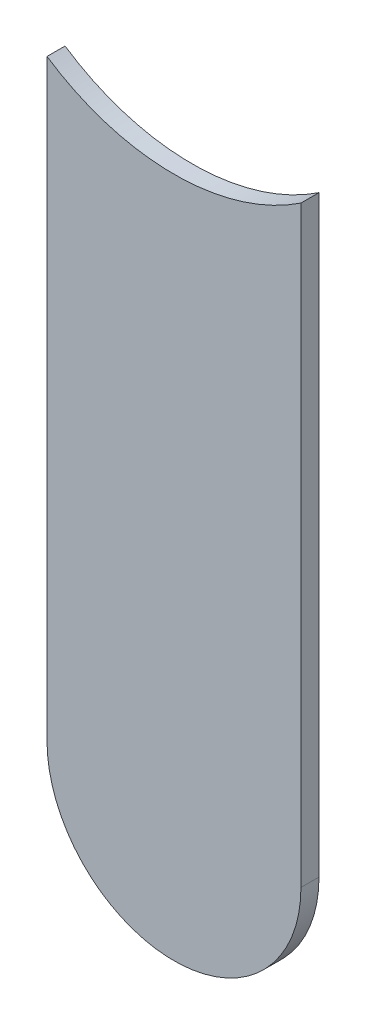
ISO-10303-21;
HEADER;
FILE_DESCRIPTION(('STEP AP214'),'2;1');
FILE_NAME('part.step','',(''),(''),'','','');
FILE_SCHEMA(('AUTOMOTIVE_DESIGN { 1 0 10303 214 1 1 1 1 }'));
ENDSEC;
DATA;
#1=APPLICATION_CONTEXT('core data for automotive mechanical design processes');
#2=APPLICATION_PROTOCOL_DEFINITION('international standard','automotive_design',2000,#1);
#3=PRODUCT_CONTEXT('',#1,'mechanical');
#4=PRODUCT('Part','Part','',(#3));
#5=PRODUCT_RELATED_PRODUCT_CATEGORY('part','',(#4));
#6=PRODUCT_DEFINITION_FORMATION('','',#4);
#7=PRODUCT_DEFINITION_CONTEXT('part definition',#1,'design');
#8=PRODUCT_DEFINITION('design','',#6,#7);
#9=PRODUCT_DEFINITION_SHAPE('','',#8);
#10=(LENGTH_UNIT() NAMED_UNIT(*) SI_UNIT(.MILLI.,.METRE.));
#11=(NAMED_UNIT(*) PLANE_ANGLE_UNIT() SI_UNIT($,.RADIAN.));
#12=(NAMED_UNIT(*) SI_UNIT($,.STERADIAN.) SOLID_ANGLE_UNIT());
#13=UNCERTAINTY_MEASURE_WITH_UNIT(LENGTH_MEASURE(1.E-05),#10,'distance_accuracy_value','');
#14=(GEOMETRIC_REPRESENTATION_CONTEXT(3) GLOBAL_UNCERTAINTY_ASSIGNED_CONTEXT((#13)) GLOBAL_UNIT_ASSIGNED_CONTEXT((#10,
#11,#12)) REPRESENTATION_CONTEXT('',''));
#15=CARTESIAN_POINT('',(0.,0.,0.));
#16=DIRECTION('',(0.,0.,1.));
#17=DIRECTION('',(1.,0.,0.));
#18=AXIS2_PLACEMENT_3D('',#15,#16,#17);
#19=CARTESIAN_POINT('',(94.0810031,92.6267896,0.));
#20=DIRECTION('',(-1.,0.,0.));
#21=DIRECTION('',(0.,1.,0.));
#22=AXIS2_PLACEMENT_3D('',#19,#20,#21);
#23=PLANE('',#22);
#24=DIRECTION('',(0.,1.,0.));
#25=VECTOR('',#24,1.);
#26=CARTESIAN_POINT('',(94.0810031,92.6267896,0.03556));
#27=LINE('',#26,#25);
#28=CARTESIAN_POINT('',(94.0810031,92.6267896,0.03556));
#29=VERTEX_POINT('',#28);
#30=CARTESIAN_POINT('',(94.0810031,93.7938458096541,0.03556));
#31=VERTEX_POINT('',#30);
#32=EDGE_CURVE('E11',#29,#31,#27,.T.);
#33=ORIENTED_EDGE('',*,*,#32,.F.);
#34=DIRECTION('',(0.,0.,1.));
#35=VECTOR('',#34,1.);
#36=CARTESIAN_POINT('',(94.0810031,92.6267896,0.));
#37=LINE('',#36,#35);
#38=CARTESIAN_POINT('',(94.0810031,92.6267896,0.));
#39=VERTEX_POINT('',#38);
#40=EDGE_CURVE('E24',#39,#29,#37,.T.);
#41=ORIENTED_EDGE('',*,*,#40,.F.);
#42=DIRECTION('',(0.,1.,0.));
#43=VECTOR('',#42,1.);
#44=CARTESIAN_POINT('',(94.0810031,92.6267896,0.));
#45=LINE('',#44,#43);
#46=CARTESIAN_POINT('',(94.0810031,93.7938458096541,0.));
#47=VERTEX_POINT('',#46);
#48=EDGE_CURVE('E75',#39,#47,#45,.T.);
#49=ORIENTED_EDGE('',*,*,#48,.T.);
#50=DIRECTION('',(0.,0.,1.));
#51=VECTOR('',#50,1.);
#52=CARTESIAN_POINT('',(94.0810031,93.7938458096541,0.));
#53=LINE('',#52,#51);
#54=EDGE_CURVE('E37',#47,#31,#53,.T.);
#55=ORIENTED_EDGE('',*,*,#54,.T.);
#56=EDGE_LOOP('',(#33,#41,#49,#55));
#57=FACE_BOUND('',#56,.T.);
#58=ADVANCED_FACE('F17',(#57),#23,.F.);
#59=CARTESIAN_POINT('',(93.8310036,94.1680108,0.));
#60=DIRECTION('',(0.,0.,-1.));
#61=DIRECTION('',(1.,0.,0.));
#62=AXIS2_PLACEMENT_3D('',#59,#60,#61);
#63=CYLINDRICAL_SURFACE('',#62,0.4499991);
#64=DIRECTION('',(0.,0.,1.));
#65=VECTOR('',#64,1.);
#66=CARTESIAN_POINT('',(93.5810041,93.7938458096541,0.));
#67=LINE('',#66,#65);
#68=CARTESIAN_POINT('',(93.5810041,93.7938458096541,0.));
#69=VERTEX_POINT('',#68);
#70=CARTESIAN_POINT('',(93.5810041,93.7938458096541,0.03556));
#71=VERTEX_POINT('',#70);
#72=EDGE_CURVE('E67',#69,#71,#67,.T.);
#73=ORIENTED_EDGE('',*,*,#72,.T.);
#74=CARTESIAN_POINT('',(93.8310036,94.1680108,0.03556));
#75=DIRECTION('',(0.,0.,1.));
#76=DIRECTION('',(1.,0.,0.));
#77=AXIS2_PLACEMENT_3D('',#74,#75,#76);
#78=CIRCLE('',#77,0.4499991);
#79=EDGE_CURVE('E82',#71,#31,#78,.T.);
#80=ORIENTED_EDGE('',*,*,#79,.T.);
#81=ORIENTED_EDGE('',*,*,#54,.F.);
#82=CARTESIAN_POINT('',(93.8310036,94.1680108,0.));
#83=DIRECTION('',(0.,0.,1.));
#84=DIRECTION('',(1.,0.,0.));
#85=AXIS2_PLACEMENT_3D('',#82,#83,#84);
#86=CIRCLE('',#85,0.4499991);
#87=EDGE_CURVE('E80',#69,#47,#86,.T.);
#88=ORIENTED_EDGE('',*,*,#87,.F.);
#89=EDGE_LOOP('',(#73,#80,#81,#88));
#90=FACE_BOUND('',#89,.T.);
#91=ADVANCED_FACE('F88',(#90),#63,.F.);
#92=CARTESIAN_POINT('',(93.5810041,93.7938458096541,0.));
#93=DIRECTION('',(1.,0.,0.));
#94=DIRECTION('',(0.,-1.,0.));
#95=AXIS2_PLACEMENT_3D('',#92,#93,#94);
#96=PLANE('',#95);
#97=DIRECTION('',(0.,-1.,0.));
#98=VECTOR('',#97,1.);
#99=CARTESIAN_POINT('',(93.5810041,94.1680108,0.03556));
#100=LINE('',#99,#98);
#101=CARTESIAN_POINT('',(93.5810041,92.6267896,0.03556));
#102=VERTEX_POINT('',#101);
#103=EDGE_CURVE('E71',#71,#102,#100,.T.);
#104=ORIENTED_EDGE('',*,*,#103,.F.);
#105=ORIENTED_EDGE('',*,*,#72,.F.);
#106=DIRECTION('',(0.,-1.,0.));
#107=VECTOR('',#106,1.);
#108=CARTESIAN_POINT('',(93.5810041,94.1680108,0.));
#109=LINE('',#108,#107);
#110=CARTESIAN_POINT('',(93.5810041,92.6267896,0.));
#111=VERTEX_POINT('',#110);
#112=EDGE_CURVE('E63',#69,#111,#109,.T.);
#113=ORIENTED_EDGE('',*,*,#112,.T.);
#114=DIRECTION('',(0.,0.,1.));
#115=VECTOR('',#114,1.);
#116=CARTESIAN_POINT('',(93.5810041,92.6267896,0.));
#117=LINE('',#116,#115);
#118=EDGE_CURVE('E53',#111,#102,#117,.T.);
#119=ORIENTED_EDGE('',*,*,#118,.T.);
#120=EDGE_LOOP('',(#104,#105,#113,#119));
#121=FACE_BOUND('',#120,.T.);
#122=ADVANCED_FACE('F66',(#121),#96,.F.);
#123=CARTESIAN_POINT('',(93.8310036,92.6267896,0.));
#124=DIRECTION('',(0.,0.,-1.));
#125=DIRECTION('',(-1.,0.,0.));
#126=AXIS2_PLACEMENT_3D('',#123,#124,#125);
#127=CYLINDRICAL_SURFACE('',#126,0.249999499999997);
#128=CARTESIAN_POINT('',(93.8310036,92.6267896,0.03556));
#129=DIRECTION('',(0.,0.,1.));
#130=DIRECTION('',(-1.,0.,0.));
#131=AXIS2_PLACEMENT_3D('',#128,#129,#130);
#132=CIRCLE('',#131,0.249999499999997);
#133=EDGE_CURVE('E59',#102,#29,#132,.T.);
#134=ORIENTED_EDGE('',*,*,#133,.F.);
#135=ORIENTED_EDGE('',*,*,#118,.F.);
#136=CARTESIAN_POINT('',(93.8310036,92.6267896,0.));
#137=DIRECTION('',(0.,0.,1.));
#138=DIRECTION('',(-1.,0.,0.));
#139=AXIS2_PLACEMENT_3D('',#136,#137,#138);
#140=CIRCLE('',#139,0.249999499999997);
#141=EDGE_CURVE('E57',#111,#39,#140,.T.);
#142=ORIENTED_EDGE('',*,*,#141,.T.);
#143=ORIENTED_EDGE('',*,*,#40,.T.);
#144=EDGE_LOOP('',(#134,#135,#142,#143));
#145=FACE_BOUND('',#144,.T.);
#146=ADVANCED_FACE('F55',(#145),#127,.T.);
#147=CARTESIAN_POINT('',(94.0810031,92.6267896,0.));
#148=DIRECTION('',(0.,0.,-1.));
#149=DIRECTION('',(-1.,0.,0.));
#150=AXIS2_PLACEMENT_3D('',#147,#148,#149);
#151=PLANE('',#150);
#152=ORIENTED_EDGE('',*,*,#48,.F.);
#153=ORIENTED_EDGE('',*,*,#141,.F.);
#154=ORIENTED_EDGE('',*,*,#112,.F.);
#155=ORIENTED_EDGE('',*,*,#87,.T.);
#156=EDGE_LOOP('',(#152,#153,#154,#155));
#157=FACE_BOUND('',#156,.T.);
#158=ADVANCED_FACE('F74',(#157),#151,.T.);
#159=CARTESIAN_POINT('',(94.0810031,92.6267896,0.03556));
#160=DIRECTION('',(0.,0.,-1.));
#161=DIRECTION('',(-1.,0.,0.));
#162=AXIS2_PLACEMENT_3D('',#159,#160,#161);
#163=PLANE('',#162);
#164=ORIENTED_EDGE('',*,*,#133,.T.);
#165=ORIENTED_EDGE('',*,*,#32,.T.);
#166=ORIENTED_EDGE('',*,*,#79,.F.);
#167=ORIENTED_EDGE('',*,*,#103,.T.);
#168=EDGE_LOOP('',(#164,#165,#166,#167));
#169=FACE_BOUND('',#168,.T.);
#170=ADVANCED_FACE('F91',(#169),#163,.F.);
#171=CLOSED_SHELL('',(#58,#91,#122,#146,#158,#170));
#172=MANIFOLD_SOLID_BREP('B1',#171);
#173=ADVANCED_BREP_SHAPE_REPRESENTATION('',(#18,#172),#14);
#174=SHAPE_DEFINITION_REPRESENTATION(#9,#173);
ENDSEC;
END-ISO-10303-21;
